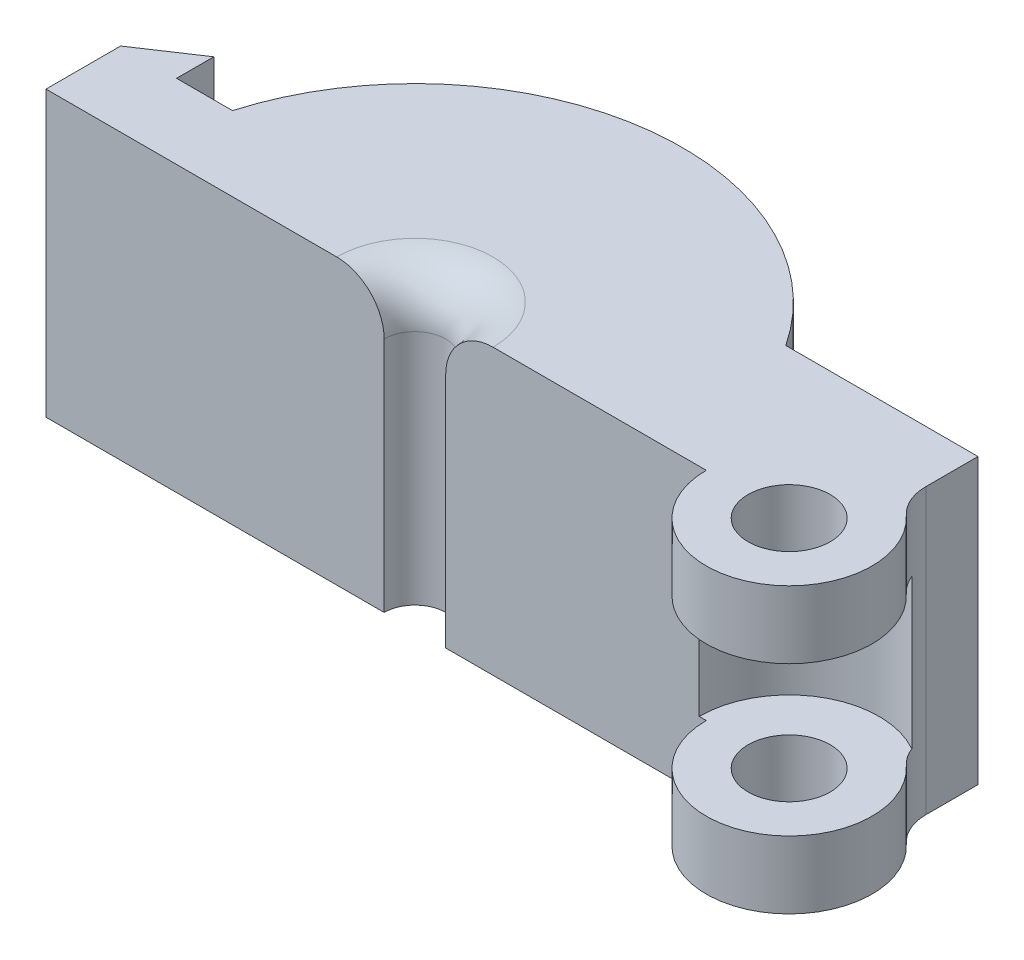
ISO-10303-21;
HEADER;
FILE_DESCRIPTION(('STEP AP214'),'2;1');
FILE_NAME('part.step','',(''),(''),'','','');
FILE_SCHEMA(('AUTOMOTIVE_DESIGN { 1 0 10303 214 1 1 1 1 }'));
ENDSEC;
DATA;
#1=APPLICATION_CONTEXT('core data for automotive mechanical design processes');
#2=APPLICATION_PROTOCOL_DEFINITION('international standard','automotive_design',2000,#1);
#3=PRODUCT_CONTEXT('',#1,'mechanical');
#4=PRODUCT('Part','Part','',(#3));
#5=PRODUCT_RELATED_PRODUCT_CATEGORY('part','',(#4));
#6=PRODUCT_DEFINITION_FORMATION('','',#4);
#7=PRODUCT_DEFINITION_CONTEXT('part definition',#1,'design');
#8=PRODUCT_DEFINITION('design','',#6,#7);
#9=PRODUCT_DEFINITION_SHAPE('','',#8);
#10=(LENGTH_UNIT() NAMED_UNIT(*) SI_UNIT(.MILLI.,.METRE.));
#11=(NAMED_UNIT(*) PLANE_ANGLE_UNIT() SI_UNIT($,.RADIAN.));
#12=(NAMED_UNIT(*) SI_UNIT($,.STERADIAN.) SOLID_ANGLE_UNIT());
#13=UNCERTAINTY_MEASURE_WITH_UNIT(LENGTH_MEASURE(1.E-05),#10,'distance_accuracy_value','');
#14=(GEOMETRIC_REPRESENTATION_CONTEXT(3) GLOBAL_UNCERTAINTY_ASSIGNED_CONTEXT((#13)) GLOBAL_UNIT_ASSIGNED_CONTEXT((#10,
#11,#12)) REPRESENTATION_CONTEXT('',''));
#15=CARTESIAN_POINT('',(0.,0.,0.));
#16=DIRECTION('',(0.,0.,1.));
#17=DIRECTION('',(1.,0.,0.));
#18=AXIS2_PLACEMENT_3D('',#15,#16,#17);
#19=CARTESIAN_POINT('',(0.,15.24,0.));
#20=DIRECTION('',(0.,0.,1.));
#21=DIRECTION('',(1.,0.,0.));
#22=AXIS2_PLACEMENT_3D('',#19,#20,#21);
#23=PLANE('',#22);
#24=DIRECTION('',(-1.,0.,0.));
#25=VECTOR('',#24,1.);
#26=CARTESIAN_POINT('',(0.,15.24,0.));
#27=LINE('',#26,#25);
#28=CARTESIAN_POINT('',(15.625,15.24,0.));
#29=VERTEX_POINT('',#28);
#30=CARTESIAN_POINT('',(4.191,15.24,0.));
#31=VERTEX_POINT('',#30);
#32=EDGE_CURVE('E223',#29,#31,#27,.T.);
#33=ORIENTED_EDGE('',*,*,#32,.T.);
#34=CARTESIAN_POINT('',(4.191,12.7,0.));
#35=DIRECTION('',(0.,0.,1.));
#36=DIRECTION('',(1.,0.,0.));
#37=AXIS2_PLACEMENT_3D('',#34,#35,#36);
#38=CIRCLE('',#37,2.54);
#39=CARTESIAN_POINT('',(1.651,12.7,0.));
#40=VERTEX_POINT('',#39);
#41=EDGE_CURVE('E329',#31,#40,#38,.T.);
#42=ORIENTED_EDGE('',*,*,#41,.T.);
#43=DIRECTION('',(0.,-1.,0.));
#44=VECTOR('',#43,1.);
#45=CARTESIAN_POINT('',(1.651,15.24,0.));
#46=LINE('',#45,#44);
#47=CARTESIAN_POINT('',(1.651,0.,0.));
#48=VERTEX_POINT('',#47);
#49=EDGE_CURVE('E290',#40,#48,#46,.T.);
#50=ORIENTED_EDGE('',*,*,#49,.T.);
#51=DIRECTION('',(-1.,0.,0.));
#52=VECTOR('',#51,1.);
#53=CARTESIAN_POINT('',(0.,0.,0.));
#54=LINE('',#53,#52);
#55=CARTESIAN_POINT('',(15.625,0.,0.));
#56=VERTEX_POINT('',#55);
#57=EDGE_CURVE('E266',#56,#48,#54,.T.);
#58=ORIENTED_EDGE('',*,*,#57,.F.);
#59=DIRECTION('',(0.,-1.,0.));
#60=VECTOR('',#59,1.);
#61=CARTESIAN_POINT('',(15.625,15.24,0.));
#62=LINE('',#61,#60);
#63=CARTESIAN_POINT('',(15.625,3.6195,0.));
#64=VERTEX_POINT('',#63);
#65=EDGE_CURVE('E286',#64,#56,#62,.T.);
#66=ORIENTED_EDGE('',*,*,#65,.F.);
#67=DIRECTION('',(-1.,0.,0.));
#68=VECTOR('',#67,1.);
#69=CARTESIAN_POINT('',(0.,3.6195,0.));
#70=LINE('',#69,#68);
#71=CARTESIAN_POINT('',(15.244,3.6195,0.));
#72=VERTEX_POINT('',#71);
#73=EDGE_CURVE('E183',#64,#72,#70,.T.);
#74=ORIENTED_EDGE('',*,*,#73,.T.);
#75=DIRECTION('',(0.,1.,0.));
#76=VECTOR('',#75,1.);
#77=CARTESIAN_POINT('',(15.244,3.6195,0.));
#78=LINE('',#77,#76);
#79=CARTESIAN_POINT('',(15.244,11.6205,0.));
#80=VERTEX_POINT('',#79);
#81=EDGE_CURVE('E174',#80,#72,#78,.F.);
#82=ORIENTED_EDGE('',*,*,#81,.F.);
#83=DIRECTION('',(-1.,0.,0.));
#84=VECTOR('',#83,1.);
#85=CARTESIAN_POINT('',(0.,11.6205,0.));
#86=LINE('',#85,#84);
#87=CARTESIAN_POINT('',(15.625,11.6205,0.));
#88=VERTEX_POINT('',#87);
#89=EDGE_CURVE('E162',#88,#80,#86,.T.);
#90=ORIENTED_EDGE('',*,*,#89,.F.);
#91=EDGE_CURVE('E287',#29,#88,#62,.T.);
#92=ORIENTED_EDGE('',*,*,#91,.F.);
#93=EDGE_LOOP('',(#33,#42,#50,#58,#66,#74,#82,#90,#92));
#94=FACE_BOUND('',#93,.T.);
#95=ADVANCED_FACE('F45',(#94),#23,.T.);
#96=CARTESIAN_POINT('',(20.07,15.24,0.));
#97=DIRECTION('',(0.,-1.,0.));
#98=DIRECTION('',(0.,0.,-1.));
#99=AXIS2_PLACEMENT_3D('',#96,#97,#98);
#100=CYLINDRICAL_SURFACE('',#99,4.445);
#101=CARTESIAN_POINT('',(20.07,0.,0.));
#102=DIRECTION('',(0.,1.,0.));
#103=DIRECTION('',(0.,0.,1.));
#104=AXIS2_PLACEMENT_3D('',#101,#102,#103);
#105=CIRCLE('',#104,4.445);
#106=CARTESIAN_POINT('',(23.0863636363636,0.,-3.26490052118333));
#107=VERTEX_POINT('',#106);
#108=EDGE_CURVE('E270',#56,#107,#105,.T.);
#109=ORIENTED_EDGE('',*,*,#108,.T.);
#110=DIRECTION('',(0.,-1.,0.));
#111=VECTOR('',#110,1.);
#112=CARTESIAN_POINT('',(23.0863636363636,15.24,-3.26490052118333));
#113=LINE('',#112,#111);
#114=CARTESIAN_POINT('',(23.0863636363636,3.6195,-3.26490052118333));
#115=VERTEX_POINT('',#114);
#116=EDGE_CURVE('E336',#107,#115,#113,.F.);
#117=ORIENTED_EDGE('',*,*,#116,.T.);
#118=CARTESIAN_POINT('',(20.07,3.6195,0.));
#119=DIRECTION('',(0.,1.,0.));
#120=DIRECTION('',(0.,0.,1.));
#121=AXIS2_PLACEMENT_3D('',#118,#119,#120);
#122=CIRCLE('',#121,4.445);
#123=EDGE_CURVE('E192',#64,#115,#122,.T.);
#124=ORIENTED_EDGE('',*,*,#123,.F.);
#125=ORIENTED_EDGE('',*,*,#65,.T.);
#126=EDGE_LOOP('',(#109,#117,#124,#125));
#127=FACE_BOUND('',#126,.T.);
#128=ADVANCED_FACE('F412',(#127),#100,.T.);
#129=CARTESIAN_POINT('',(22.27,15.24,0.));
#130=DIRECTION('',(1.,0.,0.));
#131=DIRECTION('',(0.,0.,-1.));
#132=AXIS2_PLACEMENT_3D('',#129,#130,#131);
#133=PLANE('',#132);
#134=DIRECTION('',(0.,0.,1.));
#135=VECTOR('',#134,1.);
#136=CARTESIAN_POINT('',(22.27,15.24,0.));
#137=LINE('',#136,#135);
#138=CARTESIAN_POINT('',(22.27,15.24,-7.92638592064543));
#139=VERTEX_POINT('',#138);
#140=CARTESIAN_POINT('',(22.27,15.24,-5.13055796185952));
#141=VERTEX_POINT('',#140);
#142=EDGE_CURVE('E230',#139,#141,#137,.T.);
#143=ORIENTED_EDGE('',*,*,#142,.T.);
#144=DIRECTION('',(0.,-1.,0.));
#145=VECTOR('',#144,1.);
#146=CARTESIAN_POINT('',(22.27,15.24,-5.13055796185952));
#147=LINE('',#146,#145);
#148=CARTESIAN_POINT('',(22.27,0.,-5.13055796185952));
#149=VERTEX_POINT('',#148);
#150=EDGE_CURVE('E332',#141,#149,#147,.T.);
#151=ORIENTED_EDGE('',*,*,#150,.T.);
#152=DIRECTION('',(0.,0.,1.));
#153=VECTOR('',#152,1.);
#154=CARTESIAN_POINT('',(22.27,0.,0.));
#155=LINE('',#154,#153);
#156=CARTESIAN_POINT('',(22.27,0.,-7.92638592064543));
#157=VERTEX_POINT('',#156);
#158=EDGE_CURVE('E274',#157,#149,#155,.T.);
#159=ORIENTED_EDGE('',*,*,#158,.F.);
#160=DIRECTION('',(0.,-1.,0.));
#161=VECTOR('',#160,1.);
#162=CARTESIAN_POINT('',(22.27,15.24,-7.92638592064543));
#163=LINE('',#162,#161);
#164=EDGE_CURVE('E283',#139,#157,#163,.T.);
#165=ORIENTED_EDGE('',*,*,#164,.F.);
#166=EDGE_LOOP('',(#143,#151,#159,#165));
#167=FACE_BOUND('',#166,.T.);
#168=ADVANCED_FACE('F367',(#167),#133,.T.);
#169=CARTESIAN_POINT('',(20.07,15.24,0.));
#170=DIRECTION('',(0.,-1.,0.));
#171=DIRECTION('',(0.,0.,-1.));
#172=AXIS2_PLACEMENT_3D('',#169,#170,#171);
#173=CYLINDRICAL_SURFACE('',#172,2.2);
#174=CARTESIAN_POINT('',(20.07,0.,0.));
#175=DIRECTION('',(0.,1.,0.));
#176=DIRECTION('',(0.,0.,1.));
#177=AXIS2_PLACEMENT_3D('',#174,#175,#176);
#178=CIRCLE('',#177,2.2);
#179=CARTESIAN_POINT('',(20.07,0.,-2.2));
#180=VERTEX_POINT('',#179);
#181=EDGE_CURVE('E185',#180,#180,#178,.T.);
#182=CARTESIAN_POINT('',(20.07,3.6195,0.));
#183=DIRECTION('',(0.,1.,0.));
#184=DIRECTION('',(0.,0.,1.));
#185=AXIS2_PLACEMENT_3D('',#182,#183,#184);
#186=CIRCLE('',#185,2.2);
#187=CARTESIAN_POINT('',(20.07,3.6195,-2.2));
#188=VERTEX_POINT('',#187);
#189=EDGE_CURVE('E171',#188,#188,#186,.T.);
#190=CARTESIAN_POINT('',(20.07,0.,-2.2));
#191=CARTESIAN_POINT('',(20.07,0.037703125,-2.2));
#192=CARTESIAN_POINT('',(20.07,0.07540625,-2.2));
#193=CARTESIAN_POINT('',(20.07,0.1508125,-2.2));
#194=CARTESIAN_POINT('',(20.07,0.188515625,-2.2));
#195=CARTESIAN_POINT('',(20.07,0.263921875,-2.2));
#196=CARTESIAN_POINT('',(20.07,0.301625,-2.2));
#197=CARTESIAN_POINT('',(20.07,0.37703125,-2.2));
#198=CARTESIAN_POINT('',(20.07,0.414734375,-2.2));
#199=CARTESIAN_POINT('',(20.07,0.490140625,-2.2));
#200=CARTESIAN_POINT('',(20.07,0.52784375,-2.2));
#201=CARTESIAN_POINT('',(20.07,0.60325,-2.2));
#202=CARTESIAN_POINT('',(20.07,0.640953125,-2.2));
#203=CARTESIAN_POINT('',(20.07,0.716359375,-2.2));
#204=CARTESIAN_POINT('',(20.07,0.7540625,-2.2));
#205=CARTESIAN_POINT('',(20.07,0.82946875,-2.2));
#206=CARTESIAN_POINT('',(20.07,0.867171874999999,-2.2));
#207=CARTESIAN_POINT('',(20.07,0.942578124999999,-2.2));
#208=CARTESIAN_POINT('',(20.07,0.980281249999999,-2.2));
#209=CARTESIAN_POINT('',(20.07,1.0556875,-2.2));
#210=CARTESIAN_POINT('',(20.07,1.093390625,-2.2));
#211=CARTESIAN_POINT('',(20.07,1.168796875,-2.2));
#212=CARTESIAN_POINT('',(20.07,1.2065,-2.2));
#213=CARTESIAN_POINT('',(20.07,1.28190625,-2.2));
#214=CARTESIAN_POINT('',(20.07,1.319609375,-2.2));
#215=CARTESIAN_POINT('',(20.07,1.395015625,-2.2));
#216=CARTESIAN_POINT('',(20.07,1.43271875,-2.2));
#217=CARTESIAN_POINT('',(20.07,1.508125,-2.2));
#218=CARTESIAN_POINT('',(20.07,1.545828125,-2.2));
#219=CARTESIAN_POINT('',(20.07,1.621234375,-2.2));
#220=CARTESIAN_POINT('',(20.07,1.6589375,-2.2));
#221=CARTESIAN_POINT('',(20.07,1.73434375,-2.2));
#222=CARTESIAN_POINT('',(20.07,1.772046875,-2.2));
#223=CARTESIAN_POINT('',(20.07,1.847453125,-2.2));
#224=CARTESIAN_POINT('',(20.07,1.88515625,-2.2));
#225=CARTESIAN_POINT('',(20.07,1.9605625,-2.2));
#226=CARTESIAN_POINT('',(20.07,1.998265625,-2.2));
#227=CARTESIAN_POINT('',(20.07,2.073671875,-2.2));
#228=CARTESIAN_POINT('',(20.07,2.111375,-2.2));
#229=CARTESIAN_POINT('',(20.07,2.18678125,-2.2));
#230=CARTESIAN_POINT('',(20.07,2.224484375,-2.2));
#231=CARTESIAN_POINT('',(20.07,2.299890625,-2.2));
#232=CARTESIAN_POINT('',(20.07,2.33759375,-2.2));
#233=CARTESIAN_POINT('',(20.07,2.413,-2.2));
#234=CARTESIAN_POINT('',(20.07,2.450703125,-2.2));
#235=CARTESIAN_POINT('',(20.07,2.526109375,-2.2));
#236=CARTESIAN_POINT('',(20.07,2.5638125,-2.2));
#237=CARTESIAN_POINT('',(20.07,2.63921875,-2.2));
#238=CARTESIAN_POINT('',(20.07,2.676921875,-2.2));
#239=CARTESIAN_POINT('',(20.07,2.752328125,-2.2));
#240=CARTESIAN_POINT('',(20.07,2.79003125,-2.2));
#241=CARTESIAN_POINT('',(20.07,2.8654375,-2.2));
#242=CARTESIAN_POINT('',(20.07,2.903140625,-2.2));
#243=CARTESIAN_POINT('',(20.07,2.978546875,-2.2));
#244=CARTESIAN_POINT('',(20.07,3.01625,-2.2));
#245=CARTESIAN_POINT('',(20.07,3.09165625,-2.2));
#246=CARTESIAN_POINT('',(20.07,3.129359375,-2.2));
#247=CARTESIAN_POINT('',(20.07,3.204765625,-2.2));
#248=CARTESIAN_POINT('',(20.07,3.24246875,-2.2));
#249=CARTESIAN_POINT('',(20.07,3.317875,-2.2));
#250=CARTESIAN_POINT('',(20.07,3.355578125,-2.2));
#251=CARTESIAN_POINT('',(20.07,3.430984375,-2.2));
#252=CARTESIAN_POINT('',(20.07,3.4686875,-2.2));
#253=CARTESIAN_POINT('',(20.07,3.54409375,-2.2));
#254=CARTESIAN_POINT('',(20.07,3.581796875,-2.2));
#255=CARTESIAN_POINT('',(20.07,3.6195,-2.2));
#256=B_SPLINE_CURVE_WITH_KNOTS('',3,(#190,#191,#192,#193,#194,#195,#196,#197,#198,#199,#200,
#201,#202,#203,#204,#205,#206,#207,#208,#209,#210,#211,#212,#213,#214,#215,#216,#217,#218,#219,
#220,#221,#222,#223,#224,#225,#226,#227,#228,#229,#230,#231,#232,#233,#234,#235,#236,#237,#238,
#239,#240,#241,#242,#243,#244,#245,#246,#247,#248,#249,#250,#251,#252,#253,#254,#255),
.UNSPECIFIED.,.F.,.F.,(4,2,2,2,2,2,2,2,2,2,2,2,2,2,2,2,2,2,2,2,2,2,2,2,2,2,2,2,2,2,2,2,4),(0.,
0.113109375,0.22621875,0.339328125,0.4524375,0.565546875,0.67865625,0.791765624999999,
0.904874999999999,1.017984375,1.13109375,1.244203125,1.3573125,1.470421875,1.58353125,
1.696640625,1.80975,1.922859375,2.03596875,2.149078125,2.2621875,2.375296875,2.48840625,
2.601515625,2.714625,2.827734375,2.94084375,3.053953125,3.1670625,3.280171875,3.39328125,
3.506390625,3.6195),.UNSPECIFIED.);
#257=EDGE_CURVE('BSEAM440',#180,#188,#256,.T.);
#258=ORIENTED_EDGE('',*,*,#181,.F.);
#259=ORIENTED_EDGE('',*,*,#189,.T.);
#260=ORIENTED_EDGE('',*,*,#257,.T.);
#261=ORIENTED_EDGE('',*,*,#257,.F.);
#262=EDGE_LOOP('',(#258,#260,#259,#261));
#263=FACE_BOUND('',#262,.T.);
#264=ADVANCED_FACE('F440',(#263),#173,.F.);
#265=CARTESIAN_POINT('',(0.,15.24,0.));
#266=DIRECTION('',(0.,-1.,0.));
#267=DIRECTION('',(0.,0.,-1.));
#268=AXIS2_PLACEMENT_3D('',#265,#266,#267);
#269=CYLINDRICAL_SURFACE('',#268,14.351);
#270=CARTESIAN_POINT('',(0.,0.,0.));
#271=DIRECTION('',(0.,1.,0.));
#272=DIRECTION('',(0.,0.,1.));
#273=AXIS2_PLACEMENT_3D('',#270,#271,#272);
#274=CIRCLE('',#273,14.351);
#275=CARTESIAN_POINT('',(11.9634279049524,0.,-7.92638592064543));
#276=VERTEX_POINT('',#275);
#277=CARTESIAN_POINT('',(-13.7822785126408,0.,-4.));
#278=VERTEX_POINT('',#277);
#279=EDGE_CURVE('E190',#276,#278,#274,.T.);
#280=ORIENTED_EDGE('',*,*,#279,.T.);
#281=DIRECTION('',(0.,-1.,0.));
#282=VECTOR('',#281,1.);
#283=CARTESIAN_POINT('',(-13.7822785126408,15.24,-4.));
#284=LINE('',#283,#282);
#285=CARTESIAN_POINT('',(-13.7822785126408,15.24,-4.));
#286=VERTEX_POINT('',#285);
#287=EDGE_CURVE('E308',#286,#278,#284,.T.);
#288=ORIENTED_EDGE('',*,*,#287,.F.);
#289=CARTESIAN_POINT('',(0.,15.24,0.));
#290=DIRECTION('',(0.,1.,0.));
#291=DIRECTION('',(0.,0.,1.));
#292=AXIS2_PLACEMENT_3D('',#289,#290,#291);
#293=CIRCLE('',#292,14.351);
#294=CARTESIAN_POINT('',(11.9634279049524,15.24,-7.92638592064543));
#295=VERTEX_POINT('',#294);
#296=EDGE_CURVE('E200',#295,#286,#293,.T.);
#297=ORIENTED_EDGE('',*,*,#296,.F.);
#298=DIRECTION('',(0.,-1.,0.));
#299=VECTOR('',#298,1.);
#300=CARTESIAN_POINT('',(11.9634279049524,15.24,-7.92638592064543));
#301=LINE('',#300,#299);
#302=EDGE_CURVE('E237',#295,#276,#301,.T.);
#303=ORIENTED_EDGE('',*,*,#302,.T.);
#304=EDGE_LOOP('',(#280,#288,#297,#303));
#305=FACE_BOUND('',#304,.T.);
#306=ADVANCED_FACE('F377',(#305),#269,.T.);
#307=CARTESIAN_POINT('',(0.,15.24,-4.));
#308=DIRECTION('',(0.,0.,1.));
#309=DIRECTION('',(1.,0.,0.));
#310=AXIS2_PLACEMENT_3D('',#307,#308,#309);
#311=PLANE('',#310);
#312=DIRECTION('',(-1.,0.,0.));
#313=VECTOR('',#312,1.);
#314=CARTESIAN_POINT('',(0.,0.,-4.));
#315=LINE('',#314,#313);
#316=CARTESIAN_POINT('',(-16.7822785126408,0.,-4.));
#317=VERTEX_POINT('',#316);
#318=EDGE_CURVE('E242',#278,#317,#315,.T.);
#319=ORIENTED_EDGE('',*,*,#318,.T.);
#320=DIRECTION('',(0.,-1.,0.));
#321=VECTOR('',#320,1.);
#322=CARTESIAN_POINT('',(-16.7822785126408,15.24,-4.));
#323=LINE('',#322,#321);
#324=CARTESIAN_POINT('',(-16.7822785126408,15.24,-4.));
#325=VERTEX_POINT('',#324);
#326=EDGE_CURVE('E305',#325,#317,#323,.T.);
#327=ORIENTED_EDGE('',*,*,#326,.F.);
#328=DIRECTION('',(-1.,0.,0.));
#329=VECTOR('',#328,1.);
#330=CARTESIAN_POINT('',(0.,15.24,-4.));
#331=LINE('',#330,#329);
#332=EDGE_CURVE('E205',#286,#325,#331,.T.);
#333=ORIENTED_EDGE('',*,*,#332,.F.);
#334=ORIENTED_EDGE('',*,*,#287,.T.);
#335=EDGE_LOOP('',(#319,#327,#333,#334));
#336=FACE_BOUND('',#335,.T.);
#337=ADVANCED_FACE('F380',(#336),#311,.F.);
#338=CARTESIAN_POINT('',(-16.7822785126408,15.24,0.));
#339=DIRECTION('',(1.,0.,0.));
#340=DIRECTION('',(0.,0.,-1.));
#341=AXIS2_PLACEMENT_3D('',#338,#339,#340);
#342=PLANE('',#341);
#343=DIRECTION('',(0.,0.,1.));
#344=VECTOR('',#343,1.);
#345=CARTESIAN_POINT('',(-16.7822785126408,0.,0.));
#346=LINE('',#345,#344);
#347=CARTESIAN_POINT('',(-16.7822785126408,0.,-6.));
#348=VERTEX_POINT('',#347);
#349=EDGE_CURVE('E246',#348,#317,#346,.T.);
#350=ORIENTED_EDGE('',*,*,#349,.F.);
#351=DIRECTION('',(0.,-1.,0.));
#352=VECTOR('',#351,1.);
#353=CARTESIAN_POINT('',(-16.7822785126408,15.24,-6.));
#354=LINE('',#353,#352);
#355=CARTESIAN_POINT('',(-16.7822785126408,15.24,-6.));
#356=VERTEX_POINT('',#355);
#357=EDGE_CURVE('E302',#356,#348,#354,.T.);
#358=ORIENTED_EDGE('',*,*,#357,.F.);
#359=DIRECTION('',(0.,0.,1.));
#360=VECTOR('',#359,1.);
#361=CARTESIAN_POINT('',(-16.7822785126408,15.24,0.));
#362=LINE('',#361,#360);
#363=EDGE_CURVE('E208',#356,#325,#362,.T.);
#364=ORIENTED_EDGE('',*,*,#363,.T.);
#365=ORIENTED_EDGE('',*,*,#326,.T.);
#366=EDGE_LOOP('',(#350,#358,#364,#365));
#367=FACE_BOUND('',#366,.T.);
#368=ADVANCED_FACE('F383',(#367),#342,.T.);
#369=CARTESIAN_POINT('',(-7.93300877312025,15.24,-11.8995131596804));
#370=DIRECTION('',(-0.554700196225229,0.,-0.832050294337843));
#371=DIRECTION('',(-0.832050294337844,0.,0.554700196225229));
#372=AXIS2_PLACEMENT_3D('',#369,#370,#371);
#373=PLANE('',#372);
#374=DIRECTION('',(0.832050294337844,0.,-0.554700196225229));
#375=VECTOR('',#374,1.);
#376=CARTESIAN_POINT('',(-7.93300877312025,0.,-11.8995131596804));
#377=LINE('',#376,#375);
#378=CARTESIAN_POINT('',(-19.7822785126408,0.,-4.));
#379=VERTEX_POINT('',#378);
#380=EDGE_CURVE('E250',#379,#348,#377,.T.);
#381=ORIENTED_EDGE('',*,*,#380,.F.);
#382=DIRECTION('',(0.,-1.,0.));
#383=VECTOR('',#382,1.);
#384=CARTESIAN_POINT('',(-19.7822785126408,15.24,-4.));
#385=LINE('',#384,#383);
#386=CARTESIAN_POINT('',(-19.7822785126408,15.24,-4.));
#387=VERTEX_POINT('',#386);
#388=EDGE_CURVE('E299',#387,#379,#385,.T.);
#389=ORIENTED_EDGE('',*,*,#388,.F.);
#390=DIRECTION('',(0.832050294337844,0.,-0.554700196225229));
#391=VECTOR('',#390,1.);
#392=CARTESIAN_POINT('',(-7.93300877312025,15.24,-11.8995131596804));
#393=LINE('',#392,#391);
#394=EDGE_CURVE('E212',#387,#356,#393,.T.);
#395=ORIENTED_EDGE('',*,*,#394,.T.);
#396=ORIENTED_EDGE('',*,*,#357,.T.);
#397=EDGE_LOOP('',(#381,#389,#395,#396));
#398=FACE_BOUND('',#397,.T.);
#399=ADVANCED_FACE('F388',(#398),#373,.T.);
#400=CARTESIAN_POINT('',(-19.7822785126408,15.24,0.));
#401=DIRECTION('',(-1.,0.,0.));
#402=DIRECTION('',(0.,0.,1.));
#403=AXIS2_PLACEMENT_3D('',#400,#401,#402);
#404=PLANE('',#403);
#405=DIRECTION('',(0.,0.,-1.));
#406=VECTOR('',#405,1.);
#407=CARTESIAN_POINT('',(-19.7822785126408,0.,0.));
#408=LINE('',#407,#406);
#409=CARTESIAN_POINT('',(-19.7822785126408,0.,0.));
#410=VERTEX_POINT('',#409);
#411=EDGE_CURVE('E254',#410,#379,#408,.T.);
#412=ORIENTED_EDGE('',*,*,#411,.F.);
#413=DIRECTION('',(0.,-1.,0.));
#414=VECTOR('',#413,1.);
#415=CARTESIAN_POINT('',(-19.7822785126408,15.24,0.));
#416=LINE('',#415,#414);
#417=CARTESIAN_POINT('',(-19.7822785126408,15.24,0.));
#418=VERTEX_POINT('',#417);
#419=EDGE_CURVE('E296',#418,#410,#416,.T.);
#420=ORIENTED_EDGE('',*,*,#419,.F.);
#421=DIRECTION('',(0.,0.,-1.));
#422=VECTOR('',#421,1.);
#423=CARTESIAN_POINT('',(-19.7822785126408,15.24,0.));
#424=LINE('',#423,#422);
#425=EDGE_CURVE('E216',#418,#387,#424,.T.);
#426=ORIENTED_EDGE('',*,*,#425,.T.);
#427=ORIENTED_EDGE('',*,*,#388,.T.);
#428=EDGE_LOOP('',(#412,#420,#426,#427));
#429=FACE_BOUND('',#428,.T.);
#430=ADVANCED_FACE('F391',(#429),#404,.T.);
#431=CARTESIAN_POINT('',(0.,15.24,0.));
#432=DIRECTION('',(0.,0.,1.));
#433=DIRECTION('',(1.,0.,0.));
#434=AXIS2_PLACEMENT_3D('',#431,#432,#433);
#435=PLANE('',#434);
#436=DIRECTION('',(0.,-1.,0.));
#437=VECTOR('',#436,1.);
#438=CARTESIAN_POINT('',(-1.651,15.24,0.));
#439=LINE('',#438,#437);
#440=CARTESIAN_POINT('',(-1.651,12.7,0.));
#441=VERTEX_POINT('',#440);
#442=CARTESIAN_POINT('',(-1.651,0.,0.));
#443=VERTEX_POINT('',#442);
#444=EDGE_CURVE('E293',#441,#443,#439,.T.);
#445=ORIENTED_EDGE('',*,*,#444,.F.);
#446=CARTESIAN_POINT('',(-4.191,12.7,0.));
#447=DIRECTION('',(0.,0.,1.));
#448=DIRECTION('',(1.,0.,0.));
#449=AXIS2_PLACEMENT_3D('',#446,#447,#448);
#450=CIRCLE('',#449,2.54);
#451=CARTESIAN_POINT('',(-4.191,15.24,0.));
#452=VERTEX_POINT('',#451);
#453=EDGE_CURVE('E323',#441,#452,#450,.T.);
#454=ORIENTED_EDGE('',*,*,#453,.T.);
#455=DIRECTION('',(-1.,0.,0.));
#456=VECTOR('',#455,1.);
#457=CARTESIAN_POINT('',(0.,15.24,0.));
#458=LINE('',#457,#456);
#459=EDGE_CURVE('E220',#452,#418,#458,.T.);
#460=ORIENTED_EDGE('',*,*,#459,.T.);
#461=ORIENTED_EDGE('',*,*,#419,.T.);
#462=DIRECTION('',(-1.,0.,0.));
#463=VECTOR('',#462,1.);
#464=CARTESIAN_POINT('',(0.,0.,0.));
#465=LINE('',#464,#463);
#466=EDGE_CURVE('E258',#443,#410,#465,.T.);
#467=ORIENTED_EDGE('',*,*,#466,.F.);
#468=EDGE_LOOP('',(#445,#454,#460,#461,#467));
#469=FACE_BOUND('',#468,.T.);
#470=ADVANCED_FACE('F420',(#469),#435,.T.);
#471=CARTESIAN_POINT('',(0.,15.24,0.));
#472=DIRECTION('',(0.,-1.,0.));
#473=DIRECTION('',(0.,0.,-1.));
#474=AXIS2_PLACEMENT_3D('',#471,#472,#473);
#475=CYLINDRICAL_SURFACE('',#474,1.651);
#476=ORIENTED_EDGE('',*,*,#49,.F.);
#477=CARTESIAN_POINT('',(0.,12.7,0.));
#478=DIRECTION('',(0.,1.,0.));
#479=DIRECTION('',(0.,0.,1.));
#480=AXIS2_PLACEMENT_3D('',#477,#478,#479);
#481=CIRCLE('',#480,1.651);
#482=EDGE_CURVE('E312',#40,#441,#481,.T.);
#483=ORIENTED_EDGE('',*,*,#482,.T.);
#484=ORIENTED_EDGE('',*,*,#444,.T.);
#485=CARTESIAN_POINT('',(0.,0.,0.));
#486=DIRECTION('',(0.,1.,0.));
#487=DIRECTION('',(0.,0.,1.));
#488=AXIS2_PLACEMENT_3D('',#485,#486,#487);
#489=CIRCLE('',#488,1.651);
#490=EDGE_CURVE('E262',#48,#443,#489,.T.);
#491=ORIENTED_EDGE('',*,*,#490,.F.);
#492=EDGE_LOOP('',(#476,#483,#484,#491));
#493=FACE_BOUND('',#492,.T.);
#494=ADVANCED_FACE('F403',(#493),#475,.F.);
#495=CARTESIAN_POINT('',(20.07,11.6205,0.));
#496=DIRECTION('',(0.,1.,0.));
#497=DIRECTION('',(0.,0.,1.));
#498=AXIS2_PLACEMENT_3D('',#495,#496,#497);
#499=CIRCLE('',#498,4.445);
#500=CARTESIAN_POINT('',(23.0863636363636,11.6205,-3.26490052118333));
#501=VERTEX_POINT('',#500);
#502=EDGE_CURVE('E166',#88,#501,#499,.T.);
#503=ORIENTED_EDGE('',*,*,#502,.T.);
#504=DIRECTION('',(0.,-1.,0.));
#505=VECTOR('',#504,1.);
#506=CARTESIAN_POINT('',(23.0863636363636,13.43025,-3.26490052118333));
#507=LINE('',#506,#505);
#508=CARTESIAN_POINT('',(23.0863636363636,15.24,-3.26490052118333));
#509=VERTEX_POINT('',#508);
#510=EDGE_CURVE('E339',#501,#509,#507,.F.);
#511=ORIENTED_EDGE('',*,*,#510,.T.);
#512=CARTESIAN_POINT('',(20.07,15.24,0.));
#513=DIRECTION('',(0.,1.,0.));
#514=DIRECTION('',(0.,0.,1.));
#515=AXIS2_PLACEMENT_3D('',#512,#513,#514);
#516=CIRCLE('',#515,4.445);
#517=EDGE_CURVE('E226',#29,#509,#516,.T.);
#518=ORIENTED_EDGE('',*,*,#517,.F.);
#519=ORIENTED_EDGE('',*,*,#91,.T.);
#520=EDGE_LOOP('',(#503,#511,#518,#519));
#521=FACE_BOUND('',#520,.T.);
#522=ADVANCED_FACE('F353',(#521),#100,.T.);
#523=CARTESIAN_POINT('',(20.07,11.6205,0.));
#524=DIRECTION('',(0.,1.,0.));
#525=DIRECTION('',(0.,0.,1.));
#526=AXIS2_PLACEMENT_3D('',#523,#524,#525);
#527=CIRCLE('',#526,2.2);
#528=CARTESIAN_POINT('',(20.07,11.6205,-2.2));
#529=VERTEX_POINT('',#528);
#530=EDGE_CURVE('E313',#529,#529,#527,.T.);
#531=CARTESIAN_POINT('',(20.07,15.24,0.));
#532=DIRECTION('',(0.,1.,0.));
#533=DIRECTION('',(0.,0.,1.));
#534=AXIS2_PLACEMENT_3D('',#531,#532,#533);
#535=CIRCLE('',#534,2.2);
#536=CARTESIAN_POINT('',(20.07,15.24,-2.2));
#537=VERTEX_POINT('',#536);
#538=EDGE_CURVE('E196',#537,#537,#535,.T.);
#539=CARTESIAN_POINT('',(20.07,11.6205,-2.2));
#540=CARTESIAN_POINT('',(20.07,11.658203125,-2.2));
#541=CARTESIAN_POINT('',(20.07,11.69590625,-2.2));
#542=CARTESIAN_POINT('',(20.07,11.7713125,-2.2));
#543=CARTESIAN_POINT('',(20.07,11.809015625,-2.2));
#544=CARTESIAN_POINT('',(20.07,11.884421875,-2.2));
#545=CARTESIAN_POINT('',(20.07,11.922125,-2.2));
#546=CARTESIAN_POINT('',(20.07,11.99753125,-2.2));
#547=CARTESIAN_POINT('',(20.07,12.035234375,-2.2));
#548=CARTESIAN_POINT('',(20.07,12.110640625,-2.2));
#549=CARTESIAN_POINT('',(20.07,12.14834375,-2.2));
#550=CARTESIAN_POINT('',(20.07,12.22375,-2.2));
#551=CARTESIAN_POINT('',(20.07,12.261453125,-2.2));
#552=CARTESIAN_POINT('',(20.07,12.336859375,-2.2));
#553=CARTESIAN_POINT('',(20.07,12.3745625,-2.2));
#554=CARTESIAN_POINT('',(20.07,12.44996875,-2.2));
#555=CARTESIAN_POINT('',(20.07,12.487671875,-2.2));
#556=CARTESIAN_POINT('',(20.07,12.563078125,-2.2));
#557=CARTESIAN_POINT('',(20.07,12.60078125,-2.2));
#558=CARTESIAN_POINT('',(20.07,12.6761875,-2.2));
#559=CARTESIAN_POINT('',(20.07,12.713890625,-2.2));
#560=CARTESIAN_POINT('',(20.07,12.789296875,-2.2));
#561=CARTESIAN_POINT('',(20.07,12.827,-2.2));
#562=CARTESIAN_POINT('',(20.07,12.90240625,-2.2));
#563=CARTESIAN_POINT('',(20.07,12.940109375,-2.2));
#564=CARTESIAN_POINT('',(20.07,13.015515625,-2.2));
#565=CARTESIAN_POINT('',(20.07,13.05321875,-2.2));
#566=CARTESIAN_POINT('',(20.07,13.128625,-2.2));
#567=CARTESIAN_POINT('',(20.07,13.166328125,-2.2));
#568=CARTESIAN_POINT('',(20.07,13.241734375,-2.2));
#569=CARTESIAN_POINT('',(20.07,13.2794375,-2.2));
#570=CARTESIAN_POINT('',(20.07,13.35484375,-2.2));
#571=CARTESIAN_POINT('',(20.07,13.392546875,-2.2));
#572=CARTESIAN_POINT('',(20.07,13.467953125,-2.2));
#573=CARTESIAN_POINT('',(20.07,13.50565625,-2.2));
#574=CARTESIAN_POINT('',(20.07,13.5810625,-2.2));
#575=CARTESIAN_POINT('',(20.07,13.618765625,-2.2));
#576=CARTESIAN_POINT('',(20.07,13.694171875,-2.2));
#577=CARTESIAN_POINT('',(20.07,13.731875,-2.2));
#578=CARTESIAN_POINT('',(20.07,13.80728125,-2.2));
#579=CARTESIAN_POINT('',(20.07,13.844984375,-2.2));
#580=CARTESIAN_POINT('',(20.07,13.920390625,-2.2));
#581=CARTESIAN_POINT('',(20.07,13.95809375,-2.2));
#582=CARTESIAN_POINT('',(20.07,14.0335,-2.2));
#583=CARTESIAN_POINT('',(20.07,14.071203125,-2.2));
#584=CARTESIAN_POINT('',(20.07,14.146609375,-2.2));
#585=CARTESIAN_POINT('',(20.07,14.1843125,-2.2));
#586=CARTESIAN_POINT('',(20.07,14.25971875,-2.2));
#587=CARTESIAN_POINT('',(20.07,14.297421875,-2.2));
#588=CARTESIAN_POINT('',(20.07,14.372828125,-2.2));
#589=CARTESIAN_POINT('',(20.07,14.41053125,-2.2));
#590=CARTESIAN_POINT('',(20.07,14.4859375,-2.2));
#591=CARTESIAN_POINT('',(20.07,14.523640625,-2.2));
#592=CARTESIAN_POINT('',(20.07,14.599046875,-2.2));
#593=CARTESIAN_POINT('',(20.07,14.63675,-2.2));
#594=CARTESIAN_POINT('',(20.07,14.71215625,-2.2));
#595=CARTESIAN_POINT('',(20.07,14.749859375,-2.2));
#596=CARTESIAN_POINT('',(20.07,14.825265625,-2.2));
#597=CARTESIAN_POINT('',(20.07,14.86296875,-2.2));
#598=CARTESIAN_POINT('',(20.07,14.938375,-2.2));
#599=CARTESIAN_POINT('',(20.07,14.976078125,-2.2));
#600=CARTESIAN_POINT('',(20.07,15.051484375,-2.2));
#601=CARTESIAN_POINT('',(20.07,15.0891875,-2.2));
#602=CARTESIAN_POINT('',(20.07,15.16459375,-2.2));
#603=CARTESIAN_POINT('',(20.07,15.202296875,-2.2));
#604=CARTESIAN_POINT('',(20.07,15.24,-2.2));
#605=B_SPLINE_CURVE_WITH_KNOTS('',3,(#539,#540,#541,#542,#543,#544,#545,#546,#547,#548,#549,
#550,#551,#552,#553,#554,#555,#556,#557,#558,#559,#560,#561,#562,#563,#564,#565,#566,#567,#568,
#569,#570,#571,#572,#573,#574,#575,#576,#577,#578,#579,#580,#581,#582,#583,#584,#585,#586,#587,
#588,#589,#590,#591,#592,#593,#594,#595,#596,#597,#598,#599,#600,#601,#602,#603,#604),
.UNSPECIFIED.,.F.,.F.,(4,2,2,2,2,2,2,2,2,2,2,2,2,2,2,2,2,2,2,2,2,2,2,2,2,2,2,2,2,2,2,2,4),(0.,
0.113109375,0.22621875,0.339328125,0.452437500000001,0.565546875000001,0.678656250000001,
0.791765625000001,0.904875000000001,1.017984375,1.13109375,1.244203125,1.3573125,1.470421875,
1.58353125,1.696640625,1.80975,1.922859375,2.03596875,2.149078125,2.2621875,2.375296875,
2.48840625,2.601515625,2.714625,2.827734375,2.94084375,3.053953125,3.1670625,3.280171875,
3.39328125,3.506390625,3.6195),.UNSPECIFIED.);
#606=EDGE_CURVE('BSEAM437',#529,#537,#605,.T.);
#607=ORIENTED_EDGE('',*,*,#530,.F.);
#608=ORIENTED_EDGE('',*,*,#538,.T.);
#609=ORIENTED_EDGE('',*,*,#606,.T.);
#610=ORIENTED_EDGE('',*,*,#606,.F.);
#611=EDGE_LOOP('',(#607,#609,#608,#610));
#612=FACE_BOUND('',#611,.T.);
#613=ADVANCED_FACE('F437',(#612),#173,.F.);
#614=CARTESIAN_POINT('',(0.,15.24,-7.92638592064543));
#615=DIRECTION('',(0.,0.,-1.));
#616=DIRECTION('',(-1.,0.,0.));
#617=AXIS2_PLACEMENT_3D('',#614,#615,#616);
#618=PLANE('',#617);
#619=DIRECTION('',(1.,0.,0.));
#620=VECTOR('',#619,1.);
#621=CARTESIAN_POINT('',(0.,0.,-7.92638592064543));
#622=LINE('',#621,#620);
#623=EDGE_CURVE('E201',#276,#157,#622,.T.);
#624=ORIENTED_EDGE('',*,*,#623,.F.);
#625=ORIENTED_EDGE('',*,*,#302,.F.);
#626=DIRECTION('',(1.,0.,0.));
#627=VECTOR('',#626,1.);
#628=CARTESIAN_POINT('',(0.,15.24,-7.92638592064543));
#629=LINE('',#628,#627);
#630=EDGE_CURVE('E234',#295,#139,#629,.T.);
#631=ORIENTED_EDGE('',*,*,#630,.T.);
#632=ORIENTED_EDGE('',*,*,#164,.T.);
#633=EDGE_LOOP('',(#624,#625,#631,#632));
#634=FACE_BOUND('',#633,.T.);
#635=ADVANCED_FACE('F371',(#634),#618,.T.);
#636=CARTESIAN_POINT('',(0.,15.24,0.));
#637=DIRECTION('',(0.,1.,0.));
#638=DIRECTION('',(0.,0.,1.));
#639=AXIS2_PLACEMENT_3D('',#636,#637,#638);
#640=PLANE('',#639);
#641=ORIENTED_EDGE('',*,*,#538,.F.);
#642=EDGE_LOOP('',(#641));
#643=FACE_BOUND('',#642,.T.);
#644=ORIENTED_EDGE('',*,*,#459,.F.);
#645=CARTESIAN_POINT('',(0.,15.24,0.));
#646=DIRECTION('',(0.,1.,0.));
#647=DIRECTION('',(0.,0.,1.));
#648=AXIS2_PLACEMENT_3D('',#645,#646,#647);
#649=CIRCLE('',#648,4.191);
#650=EDGE_CURVE('E326',#452,#31,#649,.F.);
#651=ORIENTED_EDGE('',*,*,#650,.T.);
#652=ORIENTED_EDGE('',*,*,#32,.F.);
#653=ORIENTED_EDGE('',*,*,#517,.T.);
#654=CARTESIAN_POINT('',(24.81,15.24,-5.13055796185952));
#655=DIRECTION('',(0.,1.,0.));
#656=DIRECTION('',(0.,0.,1.));
#657=AXIS2_PLACEMENT_3D('',#654,#655,#656);
#658=CIRCLE('',#657,2.54);
#659=EDGE_CURVE('E11',#509,#141,#658,.F.);
#660=ORIENTED_EDGE('',*,*,#659,.T.);
#661=ORIENTED_EDGE('',*,*,#142,.F.);
#662=ORIENTED_EDGE('',*,*,#630,.F.);
#663=ORIENTED_EDGE('',*,*,#296,.T.);
#664=ORIENTED_EDGE('',*,*,#332,.T.);
#665=ORIENTED_EDGE('',*,*,#363,.F.);
#666=ORIENTED_EDGE('',*,*,#394,.F.);
#667=ORIENTED_EDGE('',*,*,#425,.F.);
#668=EDGE_LOOP('',(#644,#651,#652,#653,#660,#661,#662,#663,#664,#665,#666,#667));
#669=FACE_BOUND('',#668,.T.);
#670=ADVANCED_FACE('F363',(#643,#669),#640,.T.);
#671=CARTESIAN_POINT('',(0.,0.,0.));
#672=DIRECTION('',(0.,1.,0.));
#673=DIRECTION('',(0.,0.,1.));
#674=AXIS2_PLACEMENT_3D('',#671,#672,#673);
#675=PLANE('',#674);
#676=ORIENTED_EDGE('',*,*,#181,.T.);
#677=EDGE_LOOP('',(#676));
#678=FACE_BOUND('',#677,.T.);
#679=ORIENTED_EDGE('',*,*,#279,.F.);
#680=ORIENTED_EDGE('',*,*,#623,.T.);
#681=ORIENTED_EDGE('',*,*,#158,.T.);
#682=CARTESIAN_POINT('',(24.81,0.,-5.13055796185952));
#683=DIRECTION('',(0.,1.,0.));
#684=DIRECTION('',(0.,0.,1.));
#685=AXIS2_PLACEMENT_3D('',#682,#683,#684);
#686=CIRCLE('',#685,2.54);
#687=EDGE_CURVE('E342',#149,#107,#686,.T.);
#688=ORIENTED_EDGE('',*,*,#687,.T.);
#689=ORIENTED_EDGE('',*,*,#108,.F.);
#690=ORIENTED_EDGE('',*,*,#57,.T.);
#691=ORIENTED_EDGE('',*,*,#490,.T.);
#692=ORIENTED_EDGE('',*,*,#466,.T.);
#693=ORIENTED_EDGE('',*,*,#411,.T.);
#694=ORIENTED_EDGE('',*,*,#380,.T.);
#695=ORIENTED_EDGE('',*,*,#349,.T.);
#696=ORIENTED_EDGE('',*,*,#318,.F.);
#697=EDGE_LOOP('',(#679,#680,#681,#688,#689,#690,#691,#692,#693,#694,#695,#696));
#698=FACE_BOUND('',#697,.T.);
#699=ADVANCED_FACE('F408',(#678,#698),#675,.F.);
#700=CARTESIAN_POINT('',(20.07,3.6195,0.));
#701=DIRECTION('',(0.,1.,0.));
#702=DIRECTION('',(0.,0.,1.));
#703=AXIS2_PLACEMENT_3D('',#700,#701,#702);
#704=CYLINDRICAL_SURFACE('',#703,4.826);
#705=ORIENTED_EDGE('',*,*,#81,.T.);
#706=CARTESIAN_POINT('',(20.07,3.6195,0.));
#707=DIRECTION('',(0.,1.,0.));
#708=DIRECTION('',(0.,0.,1.));
#709=AXIS2_PLACEMENT_3D('',#706,#707,#708);
#710=CIRCLE('',#709,4.826);
#711=CARTESIAN_POINT('',(22.4464758639098,3.6195,-4.20031409161913));
#712=VERTEX_POINT('',#711);
#713=EDGE_CURVE('E68',#712,#72,#710,.T.);
#714=ORIENTED_EDGE('',*,*,#713,.F.);
#715=DIRECTION('',(0.,-1.,0.));
#716=VECTOR('',#715,1.);
#717=CARTESIAN_POINT('',(22.4464758639098,3.6195,-4.20031409161918));
#718=LINE('',#717,#716);
#719=CARTESIAN_POINT('',(22.4464758639098,11.6205,-4.20031409161913));
#720=VERTEX_POINT('',#719);
#721=EDGE_CURVE('E176',#712,#720,#718,.F.);
#722=ORIENTED_EDGE('',*,*,#721,.T.);
#723=CARTESIAN_POINT('',(20.07,11.6205,0.));
#724=DIRECTION('',(0.,1.,0.));
#725=DIRECTION('',(0.,0.,1.));
#726=AXIS2_PLACEMENT_3D('',#723,#724,#725);
#727=CIRCLE('',#726,4.826);
#728=EDGE_CURVE('E61',#720,#80,#727,.T.);
#729=ORIENTED_EDGE('',*,*,#728,.T.);
#730=EDGE_LOOP('',(#705,#714,#722,#729));
#731=FACE_BOUND('',#730,.T.);
#732=ADVANCED_FACE('F173',(#731),#704,.F.);
#733=CARTESIAN_POINT('',(20.07,3.6195,0.));
#734=DIRECTION('',(0.,1.,0.));
#735=DIRECTION('',(0.,0.,1.));
#736=AXIS2_PLACEMENT_3D('',#733,#734,#735);
#737=PLANE('',#736);
#738=ORIENTED_EDGE('',*,*,#189,.F.);
#739=EDGE_LOOP('',(#738));
#740=FACE_BOUND('',#739,.T.);
#741=ORIENTED_EDGE('',*,*,#123,.T.);
#742=CARTESIAN_POINT('',(24.81,3.6195,-5.13055796185952));
#743=DIRECTION('',(0.,1.,0.));
#744=DIRECTION('',(0.,0.,1.));
#745=AXIS2_PLACEMENT_3D('',#742,#743,#744);
#746=CIRCLE('',#745,2.54);
#747=EDGE_CURVE('E345',#115,#712,#746,.F.);
#748=ORIENTED_EDGE('',*,*,#747,.T.);
#749=ORIENTED_EDGE('',*,*,#713,.T.);
#750=ORIENTED_EDGE('',*,*,#73,.F.);
#751=EDGE_LOOP('',(#741,#748,#749,#750));
#752=FACE_BOUND('',#751,.T.);
#753=ADVANCED_FACE('F419',(#740,#752),#737,.T.);
#754=CARTESIAN_POINT('',(20.07,11.6205,0.));
#755=DIRECTION('',(0.,1.,0.));
#756=DIRECTION('',(0.,0.,1.));
#757=AXIS2_PLACEMENT_3D('',#754,#755,#756);
#758=PLANE('',#757);
#759=ORIENTED_EDGE('',*,*,#89,.T.);
#760=ORIENTED_EDGE('',*,*,#728,.F.);
#761=CARTESIAN_POINT('',(24.81,11.6205,-5.13055796185952));
#762=DIRECTION('',(0.,1.,0.));
#763=DIRECTION('',(0.,0.,1.));
#764=AXIS2_PLACEMENT_3D('',#761,#762,#763);
#765=CIRCLE('',#764,2.54);
#766=EDGE_CURVE('E54',#720,#501,#765,.T.);
#767=ORIENTED_EDGE('',*,*,#766,.T.);
#768=ORIENTED_EDGE('',*,*,#502,.F.);
#769=EDGE_LOOP('',(#759,#760,#767,#768));
#770=FACE_BOUND('',#769,.T.);
#771=ORIENTED_EDGE('',*,*,#530,.T.);
#772=EDGE_LOOP('',(#771));
#773=FACE_BOUND('',#772,.T.);
#774=ADVANCED_FACE('F163',(#770,#773),#758,.F.);
#775=CARTESIAN_POINT('',(0.,12.7,0.));
#776=DIRECTION('',(0.,1.,0.));
#777=DIRECTION('',(0.,0.,1.));
#778=AXIS2_PLACEMENT_3D('',#775,#776,#777);
#779=TOROIDAL_SURFACE('',#778,4.191,2.54);
#780=ORIENTED_EDGE('',*,*,#41,.F.);
#781=ORIENTED_EDGE('',*,*,#650,.F.);
#782=ORIENTED_EDGE('',*,*,#453,.F.);
#783=ORIENTED_EDGE('',*,*,#482,.F.);
#784=EDGE_LOOP('',(#780,#781,#782,#783));
#785=FACE_BOUND('',#784,.T.);
#786=ADVANCED_FACE('F397',(#785),#779,.T.);
#787=CARTESIAN_POINT('',(24.81,15.24,-5.13055796185952));
#788=DIRECTION('',(0.,-1.,0.));
#789=DIRECTION('',(0.,0.,-1.));
#790=AXIS2_PLACEMENT_3D('',#787,#788,#789);
#791=CYLINDRICAL_SURFACE('',#790,2.54);
#792=ORIENTED_EDGE('',*,*,#747,.F.);
#793=ORIENTED_EDGE('',*,*,#116,.F.);
#794=ORIENTED_EDGE('',*,*,#687,.F.);
#795=ORIENTED_EDGE('',*,*,#150,.F.);
#796=ORIENTED_EDGE('',*,*,#659,.F.);
#797=ORIENTED_EDGE('',*,*,#510,.F.);
#798=ORIENTED_EDGE('',*,*,#766,.F.);
#799=ORIENTED_EDGE('',*,*,#721,.F.);
#800=EDGE_LOOP('',(#792,#793,#794,#795,#796,#797,#798,#799));
#801=FACE_BOUND('',#800,.T.);
#802=ADVANCED_FACE('F47',(#801),#791,.F.);
#803=CLOSED_SHELL('',(#95,#128,#168,#264,#306,#337,#368,#399,#430,#470,#494,#522,#613,#635,#670,
#699,#732,#753,#774,#786,#802));
#804=MANIFOLD_SOLID_BREP('B2',#803);
#805=ADVANCED_BREP_SHAPE_REPRESENTATION('',(#18,#804),#14);
#806=SHAPE_DEFINITION_REPRESENTATION(#9,#805);
ENDSEC;
END-ISO-10303-21;
